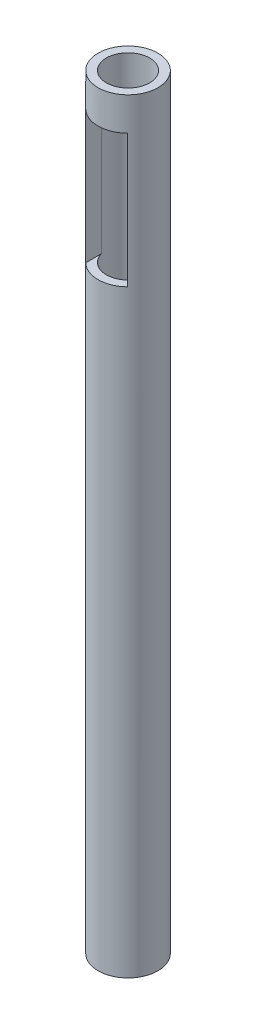
ISO-10303-21;
HEADER;
FILE_DESCRIPTION(('STEP AP214'),'2;1');
FILE_NAME('part.step','',(''),(''),'','','');
FILE_SCHEMA(('AUTOMOTIVE_DESIGN { 1 0 10303 214 1 1 1 1 }'));
ENDSEC;
DATA;
#1=APPLICATION_CONTEXT('core data for automotive mechanical design processes');
#2=APPLICATION_PROTOCOL_DEFINITION('international standard','automotive_design',2000,#1);
#3=PRODUCT_CONTEXT('',#1,'mechanical');
#4=PRODUCT('Part','Part','',(#3));
#5=PRODUCT_RELATED_PRODUCT_CATEGORY('part','',(#4));
#6=PRODUCT_DEFINITION_FORMATION('','',#4);
#7=PRODUCT_DEFINITION_CONTEXT('part definition',#1,'design');
#8=PRODUCT_DEFINITION('design','',#6,#7);
#9=PRODUCT_DEFINITION_SHAPE('','',#8);
#10=(LENGTH_UNIT() NAMED_UNIT(*) SI_UNIT(.MILLI.,.METRE.));
#11=(NAMED_UNIT(*) PLANE_ANGLE_UNIT() SI_UNIT($,.RADIAN.));
#12=(NAMED_UNIT(*) SI_UNIT($,.STERADIAN.) SOLID_ANGLE_UNIT());
#13=UNCERTAINTY_MEASURE_WITH_UNIT(LENGTH_MEASURE(1.E-05),#10,'distance_accuracy_value','');
#14=(GEOMETRIC_REPRESENTATION_CONTEXT(3) GLOBAL_UNCERTAINTY_ASSIGNED_CONTEXT((#13)) GLOBAL_UNIT_ASSIGNED_CONTEXT((#10,
#11,#12)) REPRESENTATION_CONTEXT('',''));
#15=CARTESIAN_POINT('',(0.,0.,0.));
#16=DIRECTION('',(0.,0.,1.));
#17=DIRECTION('',(1.,0.,0.));
#18=AXIS2_PLACEMENT_3D('',#15,#16,#17);
#19=CARTESIAN_POINT('',(0.,225.,0.));
#20=DIRECTION('',(0.,-1.,0.));
#21=DIRECTION('',(0.,0.,-1.));
#22=AXIS2_PLACEMENT_3D('',#19,#20,#21);
#23=CYLINDRICAL_SURFACE('',#22,18.);
#24=CARTESIAN_POINT('',(0.,-235.,0.));
#25=DIRECTION('',(0.,-1.,0.));
#26=DIRECTION('',(0.,0.,-1.));
#27=AXIS2_PLACEMENT_3D('',#24,#25,#26);
#28=CIRCLE('',#27,18.);
#29=CARTESIAN_POINT('',(0.,-235.,-18.));
#30=VERTEX_POINT('',#29);
#31=EDGE_CURVE('E107',#30,#30,#28,.T.);
#32=ORIENTED_EDGE('',*,*,#31,.F.);
#33=EDGE_LOOP('',(#32));
#34=FACE_BOUND('',#33,.T.);
#35=CARTESIAN_POINT('',(0.,225.,0.));
#36=DIRECTION('',(0.,1.,0.));
#37=DIRECTION('',(0.,0.,1.));
#38=AXIS2_PLACEMENT_3D('',#35,#36,#37);
#39=CIRCLE('',#38,18.);
#40=CARTESIAN_POINT('',(0.,225.,18.));
#41=VERTEX_POINT('',#40);
#42=EDGE_CURVE('E114',#41,#41,#39,.T.);
#43=ORIENTED_EDGE('',*,*,#42,.F.);
#44=EDGE_LOOP('',(#43));
#45=FACE_BOUND('',#44,.T.);
#46=DIRECTION('',(0.,-1.,0.));
#47=VECTOR('',#46,1.);
#48=CARTESIAN_POINT('',(12.5,225.,12.9518338469886));
#49=LINE('',#48,#47);
#50=CARTESIAN_POINT('',(12.5,125.,12.9518338469886));
#51=VERTEX_POINT('',#50);
#52=CARTESIAN_POINT('',(12.5,205.,12.9518338469886));
#53=VERTEX_POINT('',#52);
#54=EDGE_CURVE('E91',#51,#53,#49,.F.);
#55=ORIENTED_EDGE('',*,*,#54,.F.);
#56=CARTESIAN_POINT('',(0.,125.,0.));
#57=DIRECTION('',(0.,1.,0.));
#58=DIRECTION('',(0.,0.,1.));
#59=AXIS2_PLACEMENT_3D('',#56,#57,#58);
#60=CIRCLE('',#59,18.);
#61=CARTESIAN_POINT('',(-12.5,125.,12.9518338469886));
#62=VERTEX_POINT('',#61);
#63=EDGE_CURVE('E80',#62,#51,#60,.T.);
#64=ORIENTED_EDGE('',*,*,#63,.F.);
#65=DIRECTION('',(0.,-1.,0.));
#66=VECTOR('',#65,1.);
#67=CARTESIAN_POINT('',(-12.5,225.,12.9518338469886));
#68=LINE('',#67,#66);
#69=CARTESIAN_POINT('',(-12.5,205.,12.9518338469886));
#70=VERTEX_POINT('',#69);
#71=EDGE_CURVE('E85',#70,#62,#68,.T.);
#72=ORIENTED_EDGE('',*,*,#71,.F.);
#73=CARTESIAN_POINT('',(0.,205.,0.));
#74=DIRECTION('',(0.,-1.,0.));
#75=DIRECTION('',(0.,0.,-1.));
#76=AXIS2_PLACEMENT_3D('',#73,#74,#75);
#77=CIRCLE('',#76,18.);
#78=EDGE_CURVE('E96',#53,#70,#77,.T.);
#79=ORIENTED_EDGE('',*,*,#78,.F.);
#80=EDGE_LOOP('',(#55,#64,#72,#79));
#81=FACE_BOUND('',#80,.T.);
#82=ADVANCED_FACE('F43',(#34,#45,#81),#23,.T.);
#83=CARTESIAN_POINT('',(0.,225.,0.));
#84=DIRECTION('',(0.,-1.,0.));
#85=DIRECTION('',(0.,0.,-1.));
#86=AXIS2_PLACEMENT_3D('',#83,#84,#85);
#87=CYLINDRICAL_SURFACE('',#86,13.);
#88=CARTESIAN_POINT('',(0.,225.,0.));
#89=DIRECTION('',(0.,1.,0.));
#90=DIRECTION('',(0.,0.,1.));
#91=AXIS2_PLACEMENT_3D('',#88,#89,#90);
#92=CIRCLE('',#91,13.);
#93=CARTESIAN_POINT('',(0.,225.,13.));
#94=VERTEX_POINT('',#93);
#95=EDGE_CURVE('E111',#94,#94,#92,.T.);
#96=ORIENTED_EDGE('',*,*,#95,.T.);
#97=EDGE_LOOP('',(#96));
#98=FACE_BOUND('',#97,.T.);
#99=CARTESIAN_POINT('',(0.,-225.,0.));
#100=DIRECTION('',(0.,1.,0.));
#101=DIRECTION('',(0.,0.,1.));
#102=AXIS2_PLACEMENT_3D('',#99,#100,#101);
#103=CIRCLE('',#102,13.);
#104=CARTESIAN_POINT('',(0.,-225.,13.));
#105=VERTEX_POINT('',#104);
#106=EDGE_CURVE('E110',#105,#105,#103,.T.);
#107=ORIENTED_EDGE('',*,*,#106,.F.);
#108=EDGE_LOOP('',(#107));
#109=FACE_BOUND('',#108,.T.);
#110=CARTESIAN_POINT('',(0.,125.,0.));
#111=DIRECTION('',(0.,1.,0.));
#112=DIRECTION('',(0.,0.,1.));
#113=AXIS2_PLACEMENT_3D('',#110,#111,#112);
#114=CIRCLE('',#113,13.);
#115=CARTESIAN_POINT('',(-12.5,125.,3.57071421427142));
#116=VERTEX_POINT('',#115);
#117=CARTESIAN_POINT('',(12.5,125.,3.57071421427143));
#118=VERTEX_POINT('',#117);
#119=EDGE_CURVE('E118',#116,#118,#114,.T.);
#120=ORIENTED_EDGE('',*,*,#119,.T.);
#121=DIRECTION('',(0.,-1.,0.));
#122=VECTOR('',#121,1.);
#123=CARTESIAN_POINT('',(12.5,225.,3.57071421427143));
#124=LINE('',#123,#122);
#125=CARTESIAN_POINT('',(12.5,205.,3.57071421427143));
#126=VERTEX_POINT('',#125);
#127=EDGE_CURVE('E11',#118,#126,#124,.F.);
#128=ORIENTED_EDGE('',*,*,#127,.T.);
#129=CARTESIAN_POINT('',(0.,205.,0.));
#130=DIRECTION('',(0.,-1.,0.));
#131=DIRECTION('',(0.,0.,-1.));
#132=AXIS2_PLACEMENT_3D('',#129,#130,#131);
#133=CIRCLE('',#132,13.);
#134=CARTESIAN_POINT('',(-12.5,205.,3.57071421427142));
#135=VERTEX_POINT('',#134);
#136=EDGE_CURVE('E50',#126,#135,#133,.T.);
#137=ORIENTED_EDGE('',*,*,#136,.T.);
#138=DIRECTION('',(0.,-1.,0.));
#139=VECTOR('',#138,1.);
#140=CARTESIAN_POINT('',(-12.5,225.,3.57071421427142));
#141=LINE('',#140,#139);
#142=EDGE_CURVE('E121',#135,#116,#141,.T.);
#143=ORIENTED_EDGE('',*,*,#142,.T.);
#144=EDGE_LOOP('',(#120,#128,#137,#143));
#145=FACE_BOUND('',#144,.T.);
#146=ADVANCED_FACE('F125',(#98,#109,#145),#87,.F.);
#147=CARTESIAN_POINT('',(0.,225.,0.));
#148=DIRECTION('',(0.,1.,0.));
#149=DIRECTION('',(0.,0.,1.));
#150=AXIS2_PLACEMENT_3D('',#147,#148,#149);
#151=PLANE('',#150);
#152=ORIENTED_EDGE('',*,*,#42,.T.);
#153=EDGE_LOOP('',(#152));
#154=FACE_BOUND('',#153,.T.);
#155=ORIENTED_EDGE('',*,*,#95,.F.);
#156=EDGE_LOOP('',(#155));
#157=FACE_BOUND('',#156,.T.);
#158=ADVANCED_FACE('F150',(#154,#157),#151,.T.);
#159=CARTESIAN_POINT('',(0.,-225.,0.));
#160=DIRECTION('',(0.,-1.,0.));
#161=DIRECTION('',(0.,0.,-1.));
#162=AXIS2_PLACEMENT_3D('',#159,#160,#161);
#163=PLANE('',#162);
#164=CARTESIAN_POINT('',(-1.81604751869281E-13,-225.,-1.40822168197604E-13));
#165=DIRECTION('',(0.,-1.,0.));
#166=DIRECTION('',(0.,0.,-1.));
#167=AXIS2_PLACEMENT_3D('',#164,#165,#166);
#168=CIRCLE('',#167,12.55);
#169=CARTESIAN_POINT('',(-1.81604751869281E-13,-225.,-12.5500000000001));
#170=VERTEX_POINT('',#169);
#171=EDGE_CURVE('E100',#170,#170,#168,.T.);
#172=ORIENTED_EDGE('',*,*,#171,.T.);
#173=EDGE_LOOP('',(#172));
#174=FACE_BOUND('',#173,.T.);
#175=ORIENTED_EDGE('',*,*,#106,.T.);
#176=EDGE_LOOP('',(#175));
#177=FACE_BOUND('',#176,.T.);
#178=ADVANCED_FACE('F159',(#174,#177),#163,.F.);
#179=CARTESIAN_POINT('',(0.,-235.,0.));
#180=DIRECTION('',(0.,-1.,0.));
#181=DIRECTION('',(0.,0.,-1.));
#182=AXIS2_PLACEMENT_3D('',#179,#180,#181);
#183=PLANE('',#182);
#184=CARTESIAN_POINT('',(-1.80433138131577E-13,-235.,-1.41178652793946E-13));
#185=DIRECTION('',(0.,-1.,0.));
#186=DIRECTION('',(0.,0.,-1.));
#187=AXIS2_PLACEMENT_3D('',#184,#185,#186);
#188=CIRCLE('',#187,12.55);
#189=CARTESIAN_POINT('',(-1.80433138131577E-13,-235.,-12.5500000000001));
#190=VERTEX_POINT('',#189);
#191=EDGE_CURVE('E97',#190,#190,#188,.T.);
#192=ORIENTED_EDGE('',*,*,#191,.F.);
#193=EDGE_LOOP('',(#192));
#194=FACE_BOUND('',#193,.T.);
#195=ORIENTED_EDGE('',*,*,#31,.T.);
#196=EDGE_LOOP('',(#195));
#197=FACE_BOUND('',#196,.T.);
#198=ADVANCED_FACE('F165',(#194,#197),#183,.T.);
#199=CARTESIAN_POINT('',(-1.51352418738135E-13,-483.21080922492,-1.50026985807368E-13));
#200=DIRECTION('',(0.,1.,0.));
#201=DIRECTION('',(-1.,0.,0.));
#202=AXIS2_PLACEMENT_3D('',#199,#200,#201);
#203=CYLINDRICAL_SURFACE('',#202,12.55);
#204=ORIENTED_EDGE('',*,*,#191,.T.);
#205=EDGE_LOOP('',(#204));
#206=FACE_BOUND('',#205,.T.);
#207=ORIENTED_EDGE('',*,*,#171,.F.);
#208=EDGE_LOOP('',(#207));
#209=FACE_BOUND('',#208,.T.);
#210=ADVANCED_FACE('F171',(#206,#209),#203,.F.);
#211=CARTESIAN_POINT('',(12.5,125.,30.));
#212=DIRECTION('',(-1.,0.,0.));
#213=DIRECTION('',(0.,0.,1.));
#214=AXIS2_PLACEMENT_3D('',#211,#212,#213);
#215=PLANE('',#214);
#216=ORIENTED_EDGE('',*,*,#54,.T.);
#217=DIRECTION('',(0.,0.,-1.));
#218=VECTOR('',#217,1.);
#219=CARTESIAN_POINT('',(12.5,205.,30.));
#220=LINE('',#219,#218);
#221=EDGE_CURVE('E86',#53,#126,#220,.T.);
#222=ORIENTED_EDGE('',*,*,#221,.T.);
#223=ORIENTED_EDGE('',*,*,#127,.F.);
#224=DIRECTION('',(0.,0.,-1.));
#225=VECTOR('',#224,1.);
#226=CARTESIAN_POINT('',(12.5,125.,30.));
#227=LINE('',#226,#225);
#228=EDGE_CURVE('E62',#51,#118,#227,.T.);
#229=ORIENTED_EDGE('',*,*,#228,.F.);
#230=EDGE_LOOP('',(#216,#222,#223,#229));
#231=FACE_BOUND('',#230,.T.);
#232=ADVANCED_FACE('F89',(#231),#215,.T.);
#233=CARTESIAN_POINT('',(-12.5,205.,30.));
#234=DIRECTION('',(0.,-1.,0.));
#235=DIRECTION('',(0.,0.,-1.));
#236=AXIS2_PLACEMENT_3D('',#233,#234,#235);
#237=PLANE('',#236);
#238=ORIENTED_EDGE('',*,*,#78,.T.);
#239=DIRECTION('',(0.,0.,-1.));
#240=VECTOR('',#239,1.);
#241=CARTESIAN_POINT('',(-12.5,205.,30.));
#242=LINE('',#241,#240);
#243=EDGE_CURVE('E130',#70,#135,#242,.T.);
#244=ORIENTED_EDGE('',*,*,#243,.T.);
#245=ORIENTED_EDGE('',*,*,#136,.F.);
#246=ORIENTED_EDGE('',*,*,#221,.F.);
#247=EDGE_LOOP('',(#238,#244,#245,#246));
#248=FACE_BOUND('',#247,.T.);
#249=ADVANCED_FACE('F128',(#248),#237,.T.);
#250=CARTESIAN_POINT('',(-12.5,125.,30.));
#251=DIRECTION('',(1.,0.,0.));
#252=DIRECTION('',(0.,0.,-1.));
#253=AXIS2_PLACEMENT_3D('',#250,#251,#252);
#254=PLANE('',#253);
#255=ORIENTED_EDGE('',*,*,#71,.T.);
#256=DIRECTION('',(0.,0.,-1.));
#257=VECTOR('',#256,1.);
#258=CARTESIAN_POINT('',(-12.5,125.,30.));
#259=LINE('',#258,#257);
#260=EDGE_CURVE('E57',#62,#116,#259,.T.);
#261=ORIENTED_EDGE('',*,*,#260,.T.);
#262=ORIENTED_EDGE('',*,*,#142,.F.);
#263=ORIENTED_EDGE('',*,*,#243,.F.);
#264=EDGE_LOOP('',(#255,#261,#262,#263));
#265=FACE_BOUND('',#264,.T.);
#266=ADVANCED_FACE('F135',(#265),#254,.T.);
#267=CARTESIAN_POINT('',(-12.5,125.,30.));
#268=DIRECTION('',(0.,1.,0.));
#269=DIRECTION('',(0.,0.,1.));
#270=AXIS2_PLACEMENT_3D('',#267,#268,#269);
#271=PLANE('',#270);
#272=ORIENTED_EDGE('',*,*,#63,.T.);
#273=ORIENTED_EDGE('',*,*,#228,.T.);
#274=ORIENTED_EDGE('',*,*,#119,.F.);
#275=ORIENTED_EDGE('',*,*,#260,.F.);
#276=EDGE_LOOP('',(#272,#273,#274,#275));
#277=FACE_BOUND('',#276,.T.);
#278=ADVANCED_FACE('F81',(#277),#271,.T.);
#279=CLOSED_SHELL('',(#82,#146,#158,#178,#198,#210,#232,#249,#266,#278));
#280=MANIFOLD_SOLID_BREP('B2',#279);
#281=ADVANCED_BREP_SHAPE_REPRESENTATION('',(#18,#280),#14);
#282=SHAPE_DEFINITION_REPRESENTATION(#9,#281);
ENDSEC;
END-ISO-10303-21;
